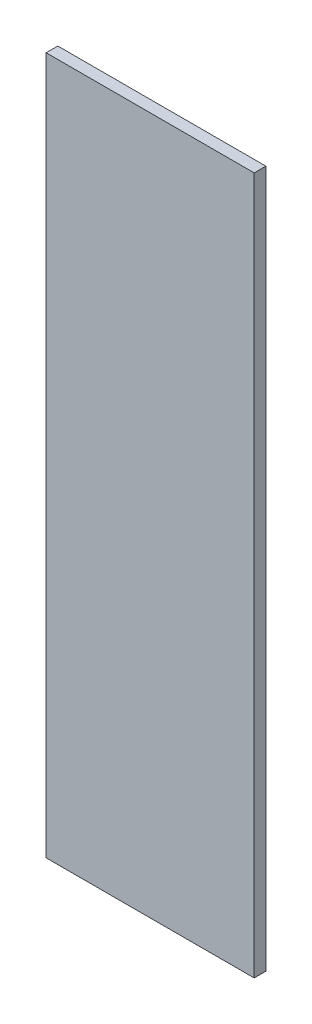
ISO-10303-21;
HEADER;
FILE_DESCRIPTION(('STEP AP214'),'2;1');
FILE_NAME('part.step','',(''),(''),'','','');
FILE_SCHEMA(('AUTOMOTIVE_DESIGN { 1 0 10303 214 1 1 1 1 }'));
ENDSEC;
DATA;
#1=APPLICATION_CONTEXT('core data for automotive mechanical design processes');
#2=APPLICATION_PROTOCOL_DEFINITION('international standard','automotive_design',2000,#1);
#3=PRODUCT_CONTEXT('',#1,'mechanical');
#4=PRODUCT('Part','Part','',(#3));
#5=PRODUCT_RELATED_PRODUCT_CATEGORY('part','',(#4));
#6=PRODUCT_DEFINITION_FORMATION('','',#4);
#7=PRODUCT_DEFINITION_CONTEXT('part definition',#1,'design');
#8=PRODUCT_DEFINITION('design','',#6,#7);
#9=PRODUCT_DEFINITION_SHAPE('','',#8);
#10=(LENGTH_UNIT() NAMED_UNIT(*) SI_UNIT(.MILLI.,.METRE.));
#11=(NAMED_UNIT(*) PLANE_ANGLE_UNIT() SI_UNIT($,.RADIAN.));
#12=(NAMED_UNIT(*) SI_UNIT($,.STERADIAN.) SOLID_ANGLE_UNIT());
#13=UNCERTAINTY_MEASURE_WITH_UNIT(LENGTH_MEASURE(1.E-05),#10,'distance_accuracy_value','');
#14=(GEOMETRIC_REPRESENTATION_CONTEXT(3) GLOBAL_UNCERTAINTY_ASSIGNED_CONTEXT((#13)) GLOBAL_UNIT_ASSIGNED_CONTEXT((#10,
#11,#12)) REPRESENTATION_CONTEXT('',''));
#15=CARTESIAN_POINT('',(0.,0.,0.));
#16=DIRECTION('',(0.,0.,1.));
#17=DIRECTION('',(1.,0.,0.));
#18=AXIS2_PLACEMENT_3D('',#15,#16,#17);
#19=CARTESIAN_POINT('',(83.3850523867748,204.196458045684,3.175));
#20=DIRECTION('',(1.,0.,0.));
#21=DIRECTION('',(0.,0.,-1.));
#22=AXIS2_PLACEMENT_3D('',#19,#20,#21);
#23=PLANE('',#22);
#24=DIRECTION('',(0.,-1.,0.));
#25=VECTOR('',#24,1.);
#26=CARTESIAN_POINT('',(83.3850523867748,204.196458045684,0.));
#27=LINE('',#26,#25);
#28=CARTESIAN_POINT('',(83.3850523867748,204.196458045684,0.));
#29=VERTEX_POINT('',#28);
#30=CARTESIAN_POINT('',(83.3850523867748,14.540458169685,0.));
#31=VERTEX_POINT('',#30);
#32=EDGE_CURVE('E99',#29,#31,#27,.T.);
#33=ORIENTED_EDGE('',*,*,#32,.T.);
#34=DIRECTION('',(0.,0.,-1.));
#35=VECTOR('',#34,1.);
#36=CARTESIAN_POINT('',(83.3850523867748,14.540458169685,3.175));
#37=LINE('',#36,#35);
#38=CARTESIAN_POINT('',(83.3850523867748,14.540458169685,3.175));
#39=VERTEX_POINT('',#38);
#40=EDGE_CURVE('E11',#39,#31,#37,.T.);
#41=ORIENTED_EDGE('',*,*,#40,.F.);
#42=DIRECTION('',(0.,-1.,0.));
#43=VECTOR('',#42,1.);
#44=CARTESIAN_POINT('',(83.3850523867748,204.196458045684,3.175));
#45=LINE('',#44,#43);
#46=CARTESIAN_POINT('',(83.3850523867748,204.196458045684,3.175));
#47=VERTEX_POINT('',#46);
#48=EDGE_CURVE('E87',#47,#39,#45,.T.);
#49=ORIENTED_EDGE('',*,*,#48,.F.);
#50=DIRECTION('',(0.,0.,-1.));
#51=VECTOR('',#50,1.);
#52=CARTESIAN_POINT('',(83.3850523867748,204.196458045684,3.175));
#53=LINE('',#52,#51);
#54=EDGE_CURVE('E95',#47,#29,#53,.T.);
#55=ORIENTED_EDGE('',*,*,#54,.T.);
#56=EDGE_LOOP('',(#33,#41,#49,#55));
#57=FACE_BOUND('',#56,.T.);
#58=ADVANCED_FACE('F36',(#57),#23,.F.);
#59=CARTESIAN_POINT('',(83.3850523867748,14.540458169685,3.175));
#60=DIRECTION('',(0.,1.,0.));
#61=DIRECTION('',(0.,0.,1.));
#62=AXIS2_PLACEMENT_3D('',#59,#60,#61);
#63=PLANE('',#62);
#64=DIRECTION('',(1.,0.,0.));
#65=VECTOR('',#64,1.);
#66=CARTESIAN_POINT('',(83.3850523867748,14.540458169685,0.));
#67=LINE('',#66,#65);
#68=CARTESIAN_POINT('',(139.983872386774,14.540458169685,0.));
#69=VERTEX_POINT('',#68);
#70=EDGE_CURVE('E91',#31,#69,#67,.T.);
#71=ORIENTED_EDGE('',*,*,#70,.T.);
#72=DIRECTION('',(0.,0.,-1.));
#73=VECTOR('',#72,1.);
#74=CARTESIAN_POINT('',(139.983872386774,14.540458169685,3.175));
#75=LINE('',#74,#73);
#76=CARTESIAN_POINT('',(139.983872386774,14.540458169685,3.175));
#77=VERTEX_POINT('',#76);
#78=EDGE_CURVE('E44',#77,#69,#75,.T.);
#79=ORIENTED_EDGE('',*,*,#78,.F.);
#80=DIRECTION('',(1.,0.,0.));
#81=VECTOR('',#80,1.);
#82=CARTESIAN_POINT('',(83.3850523867748,14.540458169685,3.175));
#83=LINE('',#82,#81);
#84=EDGE_CURVE('E82',#39,#77,#83,.T.);
#85=ORIENTED_EDGE('',*,*,#84,.F.);
#86=ORIENTED_EDGE('',*,*,#40,.T.);
#87=EDGE_LOOP('',(#71,#79,#85,#86));
#88=FACE_BOUND('',#87,.T.);
#89=ADVANCED_FACE('F90',(#88),#63,.F.);
#90=CARTESIAN_POINT('',(139.983872386774,204.196458045684,3.175));
#91=DIRECTION('',(-1.,0.,0.));
#92=DIRECTION('',(0.,0.,1.));
#93=AXIS2_PLACEMENT_3D('',#90,#91,#92);
#94=PLANE('',#93);
#95=DIRECTION('',(0.,1.,0.));
#96=VECTOR('',#95,1.);
#97=CARTESIAN_POINT('',(139.983872386774,204.196458045684,0.));
#98=LINE('',#97,#96);
#99=CARTESIAN_POINT('',(139.983872386774,204.196458045684,0.));
#100=VERTEX_POINT('',#99);
#101=EDGE_CURVE('E69',#69,#100,#98,.T.);
#102=ORIENTED_EDGE('',*,*,#101,.T.);
#103=DIRECTION('',(0.,0.,-1.));
#104=VECTOR('',#103,1.);
#105=CARTESIAN_POINT('',(139.983872386774,204.196458045684,3.175));
#106=LINE('',#105,#104);
#107=CARTESIAN_POINT('',(139.983872386774,204.196458045684,3.175));
#108=VERTEX_POINT('',#107);
#109=EDGE_CURVE('E92',#108,#100,#106,.T.);
#110=ORIENTED_EDGE('',*,*,#109,.F.);
#111=DIRECTION('',(0.,1.,0.));
#112=VECTOR('',#111,1.);
#113=CARTESIAN_POINT('',(139.983872386774,204.196458045684,3.175));
#114=LINE('',#113,#112);
#115=EDGE_CURVE('E85',#77,#108,#114,.T.);
#116=ORIENTED_EDGE('',*,*,#115,.F.);
#117=ORIENTED_EDGE('',*,*,#78,.T.);
#118=EDGE_LOOP('',(#102,#110,#116,#117));
#119=FACE_BOUND('',#118,.T.);
#120=ADVANCED_FACE('F93',(#119),#94,.F.);
#121=CARTESIAN_POINT('',(83.3850523867748,204.196458045684,3.175));
#122=DIRECTION('',(0.,-1.,0.));
#123=DIRECTION('',(0.,0.,-1.));
#124=AXIS2_PLACEMENT_3D('',#121,#122,#123);
#125=PLANE('',#124);
#126=DIRECTION('',(-1.,0.,0.));
#127=VECTOR('',#126,1.);
#128=CARTESIAN_POINT('',(83.3850523867748,204.196458045684,0.));
#129=LINE('',#128,#127);
#130=EDGE_CURVE('E75',#100,#29,#129,.T.);
#131=ORIENTED_EDGE('',*,*,#130,.T.);
#132=ORIENTED_EDGE('',*,*,#54,.F.);
#133=DIRECTION('',(-1.,0.,0.));
#134=VECTOR('',#133,1.);
#135=CARTESIAN_POINT('',(83.3850523867748,204.196458045684,3.175));
#136=LINE('',#135,#134);
#137=EDGE_CURVE('E52',#108,#47,#136,.T.);
#138=ORIENTED_EDGE('',*,*,#137,.F.);
#139=ORIENTED_EDGE('',*,*,#109,.T.);
#140=EDGE_LOOP('',(#131,#132,#138,#139));
#141=FACE_BOUND('',#140,.T.);
#142=ADVANCED_FACE('F106',(#141),#125,.F.);
#143=CARTESIAN_POINT('',(0.,0.,3.175));
#144=DIRECTION('',(0.,0.,1.));
#145=DIRECTION('',(1.,0.,0.));
#146=AXIS2_PLACEMENT_3D('',#143,#144,#145);
#147=PLANE('',#146);
#148=ORIENTED_EDGE('',*,*,#48,.T.);
#149=ORIENTED_EDGE('',*,*,#84,.T.);
#150=ORIENTED_EDGE('',*,*,#115,.T.);
#151=ORIENTED_EDGE('',*,*,#137,.T.);
#152=EDGE_LOOP('',(#148,#149,#150,#151));
#153=FACE_BOUND('',#152,.T.);
#154=ADVANCED_FACE('F83',(#153),#147,.T.);
#155=CARTESIAN_POINT('',(0.,0.,0.));
#156=DIRECTION('',(0.,0.,1.));
#157=DIRECTION('',(1.,0.,0.));
#158=AXIS2_PLACEMENT_3D('',#155,#156,#157);
#159=PLANE('',#158);
#160=ORIENTED_EDGE('',*,*,#32,.F.);
#161=ORIENTED_EDGE('',*,*,#130,.F.);
#162=ORIENTED_EDGE('',*,*,#101,.F.);
#163=ORIENTED_EDGE('',*,*,#70,.F.);
#164=EDGE_LOOP('',(#160,#161,#162,#163));
#165=FACE_BOUND('',#164,.T.);
#166=ADVANCED_FACE('F109',(#165),#159,.F.);
#167=CLOSED_SHELL('',(#58,#89,#120,#142,#154,#166));
#168=MANIFOLD_SOLID_BREP('B2',#167);
#169=ADVANCED_BREP_SHAPE_REPRESENTATION('',(#18,#168),#14);
#170=SHAPE_DEFINITION_REPRESENTATION(#9,#169);
ENDSEC;
END-ISO-10303-21;
